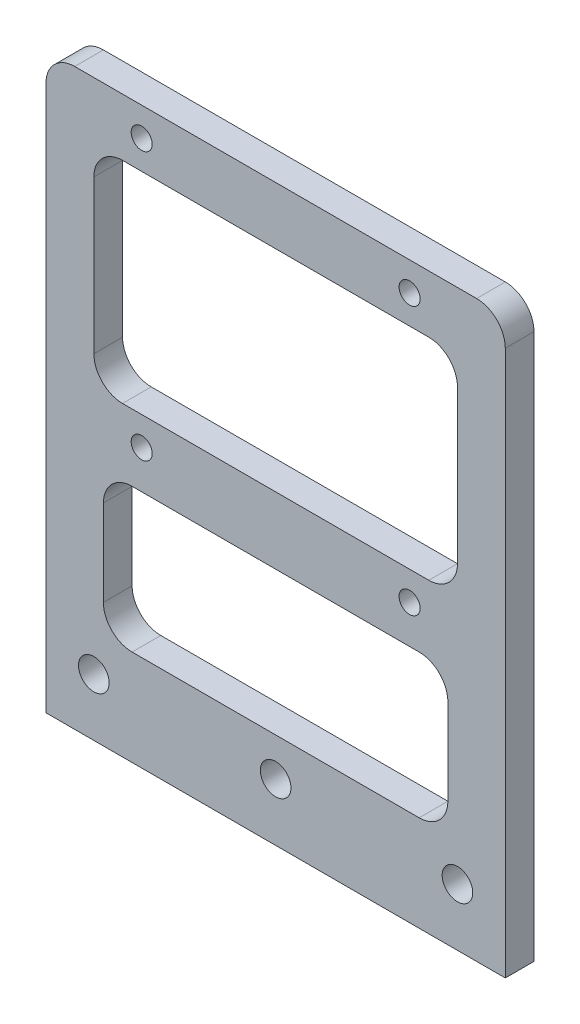
ISO-10303-21;
HEADER;
FILE_DESCRIPTION(('STEP AP214'),'2;1');
FILE_NAME('part.step','',(''),(''),'','','');
FILE_SCHEMA(('AUTOMOTIVE_DESIGN { 1 0 10303 214 1 1 1 1 }'));
ENDSEC;
DATA;
#1=APPLICATION_CONTEXT('core data for automotive mechanical design processes');
#2=APPLICATION_PROTOCOL_DEFINITION('international standard','automotive_design',2000,#1);
#3=PRODUCT_CONTEXT('',#1,'mechanical');
#4=PRODUCT('Part','Part','',(#3));
#5=PRODUCT_RELATED_PRODUCT_CATEGORY('part','',(#4));
#6=PRODUCT_DEFINITION_FORMATION('','',#4);
#7=PRODUCT_DEFINITION_CONTEXT('part definition',#1,'design');
#8=PRODUCT_DEFINITION('design','',#6,#7);
#9=PRODUCT_DEFINITION_SHAPE('','',#8);
#10=(LENGTH_UNIT() NAMED_UNIT(*) SI_UNIT(.MILLI.,.METRE.));
#11=(NAMED_UNIT(*) PLANE_ANGLE_UNIT() SI_UNIT($,.RADIAN.));
#12=(NAMED_UNIT(*) SI_UNIT($,.STERADIAN.) SOLID_ANGLE_UNIT());
#13=UNCERTAINTY_MEASURE_WITH_UNIT(LENGTH_MEASURE(1.E-05),#10,'distance_accuracy_value','');
#14=(GEOMETRIC_REPRESENTATION_CONTEXT(3) GLOBAL_UNCERTAINTY_ASSIGNED_CONTEXT((#13)) GLOBAL_UNIT_ASSIGNED_CONTEXT((#10,
#11,#12)) REPRESENTATION_CONTEXT('',''));
#15=CARTESIAN_POINT('',(0.,0.,0.));
#16=DIRECTION('',(0.,0.,1.));
#17=DIRECTION('',(1.,0.,0.));
#18=AXIS2_PLACEMENT_3D('',#15,#16,#17);
#19=CARTESIAN_POINT('',(0.,0.,3.));
#20=DIRECTION('',(0.,0.,-1.));
#21=DIRECTION('',(-1.,0.,0.));
#22=AXIS2_PLACEMENT_3D('',#19,#20,#21);
#23=PLANE('',#22);
#24=DIRECTION('',(0.,-1.,0.));
#25=VECTOR('',#24,1.);
#26=CARTESIAN_POINT('',(-18.,25.,3.));
#27=LINE('',#26,#25);
#28=CARTESIAN_POINT('',(-18.,22.,3.));
#29=VERTEX_POINT('',#28);
#30=CARTESIAN_POINT('',(-18.,13.,3.));
#31=VERTEX_POINT('',#30);
#32=EDGE_CURVE('E335',#29,#31,#27,.T.);
#33=ORIENTED_EDGE('',*,*,#32,.F.);
#34=CARTESIAN_POINT('',(-15.,22.,3.));
#35=DIRECTION('',(0.,0.,-1.));
#36=DIRECTION('',(-1.,0.,0.));
#37=AXIS2_PLACEMENT_3D('',#34,#35,#36);
#38=CIRCLE('',#37,3.);
#39=CARTESIAN_POINT('',(-15.,25.,3.));
#40=VERTEX_POINT('',#39);
#41=EDGE_CURVE('E11',#29,#40,#38,.T.);
#42=ORIENTED_EDGE('',*,*,#41,.T.);
#43=DIRECTION('',(-1.,0.,0.));
#44=VECTOR('',#43,1.);
#45=CARTESIAN_POINT('',(18.,25.,3.));
#46=LINE('',#45,#44);
#47=CARTESIAN_POINT('',(15.,25.,3.));
#48=VERTEX_POINT('',#47);
#49=EDGE_CURVE('E317',#48,#40,#46,.T.);
#50=ORIENTED_EDGE('',*,*,#49,.F.);
#51=CARTESIAN_POINT('',(15.,22.,3.));
#52=DIRECTION('',(0.,0.,-1.));
#53=DIRECTION('',(-1.,0.,0.));
#54=AXIS2_PLACEMENT_3D('',#51,#52,#53);
#55=CIRCLE('',#54,3.);
#56=CARTESIAN_POINT('',(18.,22.,3.));
#57=VERTEX_POINT('',#56);
#58=EDGE_CURVE('E296',#48,#57,#55,.T.);
#59=ORIENTED_EDGE('',*,*,#58,.T.);
#60=DIRECTION('',(0.,1.,0.));
#61=VECTOR('',#60,1.);
#62=CARTESIAN_POINT('',(18.,10.,3.));
#63=LINE('',#62,#61);
#64=CARTESIAN_POINT('',(18.,13.,3.));
#65=VERTEX_POINT('',#64);
#66=EDGE_CURVE('E320',#65,#57,#63,.T.);
#67=ORIENTED_EDGE('',*,*,#66,.F.);
#68=CARTESIAN_POINT('',(15.,13.,3.));
#69=DIRECTION('',(0.,0.,-1.));
#70=DIRECTION('',(-1.,0.,0.));
#71=AXIS2_PLACEMENT_3D('',#68,#69,#70);
#72=CIRCLE('',#71,3.);
#73=CARTESIAN_POINT('',(15.,10.,3.));
#74=VERTEX_POINT('',#73);
#75=EDGE_CURVE('E288',#65,#74,#72,.T.);
#76=ORIENTED_EDGE('',*,*,#75,.T.);
#77=DIRECTION('',(1.,0.,0.));
#78=VECTOR('',#77,1.);
#79=CARTESIAN_POINT('',(-18.,9.99999999999999,3.));
#80=LINE('',#79,#78);
#81=CARTESIAN_POINT('',(-15.,10.,3.));
#82=VERTEX_POINT('',#81);
#83=EDGE_CURVE('E326',#82,#74,#80,.T.);
#84=ORIENTED_EDGE('',*,*,#83,.F.);
#85=CARTESIAN_POINT('',(-15.,13.,3.));
#86=DIRECTION('',(0.,0.,-1.));
#87=DIRECTION('',(-1.,0.,0.));
#88=AXIS2_PLACEMENT_3D('',#85,#86,#87);
#89=CIRCLE('',#88,3.);
#90=EDGE_CURVE('E292',#82,#31,#89,.T.);
#91=ORIENTED_EDGE('',*,*,#90,.T.);
#92=EDGE_LOOP('',(#33,#42,#50,#59,#67,#76,#84,#91));
#93=FACE_BOUND('',#92,.T.);
#94=DIRECTION('',(-1.,0.,0.));
#95=VECTOR('',#94,1.);
#96=CARTESIAN_POINT('',(-24.,60.,3.));
#97=LINE('',#96,#95);
#98=CARTESIAN_POINT('',(21.,60.,3.));
#99=VERTEX_POINT('',#98);
#100=CARTESIAN_POINT('',(-21.,60.,3.));
#101=VERTEX_POINT('',#100);
#102=EDGE_CURVE('E214',#99,#101,#97,.T.);
#103=ORIENTED_EDGE('',*,*,#102,.T.);
#104=CARTESIAN_POINT('',(-21.,57.,3.));
#105=DIRECTION('',(0.,0.,-1.));
#106=DIRECTION('',(-1.,0.,0.));
#107=AXIS2_PLACEMENT_3D('',#104,#105,#106);
#108=CIRCLE('',#107,3.);
#109=CARTESIAN_POINT('',(-24.,57.,3.));
#110=VERTEX_POINT('',#109);
#111=EDGE_CURVE('E190',#101,#110,#108,.F.);
#112=ORIENTED_EDGE('',*,*,#111,.T.);
#113=DIRECTION('',(0.,-1.,0.));
#114=VECTOR('',#113,1.);
#115=CARTESIAN_POINT('',(-24.,0.,3.));
#116=LINE('',#115,#114);
#117=CARTESIAN_POINT('',(-24.,0.,3.));
#118=VERTEX_POINT('',#117);
#119=EDGE_CURVE('E182',#110,#118,#116,.T.);
#120=ORIENTED_EDGE('',*,*,#119,.T.);
#121=DIRECTION('',(1.,0.,0.));
#122=VECTOR('',#121,1.);
#123=CARTESIAN_POINT('',(-24.,0.,3.));
#124=LINE('',#123,#122);
#125=CARTESIAN_POINT('',(24.,0.,3.));
#126=VERTEX_POINT('',#125);
#127=EDGE_CURVE('E187',#118,#126,#124,.T.);
#128=ORIENTED_EDGE('',*,*,#127,.T.);
#129=DIRECTION('',(0.,1.,0.));
#130=VECTOR('',#129,1.);
#131=CARTESIAN_POINT('',(24.,0.,3.));
#132=LINE('',#131,#130);
#133=CARTESIAN_POINT('',(24.,57.,3.));
#134=VERTEX_POINT('',#133);
#135=EDGE_CURVE('E204',#126,#134,#132,.T.);
#136=ORIENTED_EDGE('',*,*,#135,.T.);
#137=CARTESIAN_POINT('',(21.,57.,3.));
#138=DIRECTION('',(0.,0.,-1.));
#139=DIRECTION('',(-1.,0.,0.));
#140=AXIS2_PLACEMENT_3D('',#137,#138,#139);
#141=CIRCLE('',#140,3.);
#142=EDGE_CURVE('E226',#134,#99,#141,.F.);
#143=ORIENTED_EDGE('',*,*,#142,.T.);
#144=EDGE_LOOP('',(#103,#112,#120,#128,#136,#143));
#145=FACE_BOUND('',#144,.T.);
#146=CARTESIAN_POINT('',(0.,6.,3.));
#147=DIRECTION('',(0.,0.,1.));
#148=DIRECTION('',(1.,0.,0.));
#149=AXIS2_PLACEMENT_3D('',#146,#147,#148);
#150=CIRCLE('',#149,1.6);
#151=CARTESIAN_POINT('',(1.60000000000001,6.,3.));
#152=VERTEX_POINT('',#151);
#153=EDGE_CURVE('E369',#152,#152,#150,.T.);
#154=ORIENTED_EDGE('',*,*,#153,.F.);
#155=EDGE_LOOP('',(#154));
#156=FACE_BOUND('',#155,.T.);
#157=CARTESIAN_POINT('',(-19.,6.,3.));
#158=DIRECTION('',(0.,0.,1.));
#159=DIRECTION('',(1.,0.,0.));
#160=AXIS2_PLACEMENT_3D('',#157,#158,#159);
#161=CIRCLE('',#160,1.6);
#162=CARTESIAN_POINT('',(-17.4,6.,3.));
#163=VERTEX_POINT('',#162);
#164=EDGE_CURVE('E363',#163,#163,#161,.T.);
#165=ORIENTED_EDGE('',*,*,#164,.F.);
#166=EDGE_LOOP('',(#165));
#167=FACE_BOUND('',#166,.T.);
#168=CARTESIAN_POINT('',(19.,6.,3.));
#169=DIRECTION('',(0.,0.,1.));
#170=DIRECTION('',(1.,0.,0.));
#171=AXIS2_PLACEMENT_3D('',#168,#169,#170);
#172=CIRCLE('',#171,1.6);
#173=CARTESIAN_POINT('',(20.6,6.,3.));
#174=VERTEX_POINT('',#173);
#175=EDGE_CURVE('E357',#174,#174,#172,.T.);
#176=ORIENTED_EDGE('',*,*,#175,.F.);
#177=EDGE_LOOP('',(#176));
#178=FACE_BOUND('',#177,.T.);
#179=CARTESIAN_POINT('',(-14.,57.,3.));
#180=DIRECTION('',(0.,0.,1.));
#181=DIRECTION('',(1.,0.,0.));
#182=AXIS2_PLACEMENT_3D('',#179,#180,#181);
#183=CIRCLE('',#182,1.1);
#184=CARTESIAN_POINT('',(-12.9,57.,3.));
#185=VERTEX_POINT('',#184);
#186=EDGE_CURVE('E351',#185,#185,#183,.T.);
#187=ORIENTED_EDGE('',*,*,#186,.F.);
#188=EDGE_LOOP('',(#187));
#189=FACE_BOUND('',#188,.T.);
#190=CARTESIAN_POINT('',(-14.,29.,3.));
#191=DIRECTION('',(0.,0.,1.));
#192=DIRECTION('',(1.,0.,0.));
#193=AXIS2_PLACEMENT_3D('',#190,#191,#192);
#194=CIRCLE('',#193,1.1);
#195=CARTESIAN_POINT('',(-12.9,29.,3.));
#196=VERTEX_POINT('',#195);
#197=EDGE_CURVE('E345',#196,#196,#194,.T.);
#198=ORIENTED_EDGE('',*,*,#197,.F.);
#199=EDGE_LOOP('',(#198));
#200=FACE_BOUND('',#199,.T.);
#201=CARTESIAN_POINT('',(14.,57.,3.));
#202=DIRECTION('',(0.,0.,1.));
#203=DIRECTION('',(1.,0.,0.));
#204=AXIS2_PLACEMENT_3D('',#201,#202,#203);
#205=CIRCLE('',#204,1.1);
#206=CARTESIAN_POINT('',(15.1,57.,3.));
#207=VERTEX_POINT('',#206);
#208=EDGE_CURVE('E339',#207,#207,#205,.T.);
#209=ORIENTED_EDGE('',*,*,#208,.F.);
#210=EDGE_LOOP('',(#209));
#211=FACE_BOUND('',#210,.T.);
#212=CARTESIAN_POINT('',(14.,29.,3.));
#213=DIRECTION('',(0.,0.,1.));
#214=DIRECTION('',(1.,0.,0.));
#215=AXIS2_PLACEMENT_3D('',#212,#213,#214);
#216=CIRCLE('',#215,1.1);
#217=CARTESIAN_POINT('',(15.1,29.,3.));
#218=VERTEX_POINT('',#217);
#219=EDGE_CURVE('E323',#218,#218,#216,.T.);
#220=ORIENTED_EDGE('',*,*,#219,.F.);
#221=EDGE_LOOP('',(#220));
#222=FACE_BOUND('',#221,.T.);
#223=DIRECTION('',(0.,1.,0.));
#224=VECTOR('',#223,1.);
#225=CARTESIAN_POINT('',(19.,54.,3.));
#226=LINE('',#225,#224);
#227=CARTESIAN_POINT('',(19.,35.,3.));
#228=VERTEX_POINT('',#227);
#229=CARTESIAN_POINT('',(19.,51.,3.));
#230=VERTEX_POINT('',#229);
#231=EDGE_CURVE('E708',#228,#230,#226,.T.);
#232=ORIENTED_EDGE('',*,*,#231,.F.);
#233=CARTESIAN_POINT('',(16.,35.,3.));
#234=DIRECTION('',(0.,0.,-1.));
#235=DIRECTION('',(-1.,0.,0.));
#236=AXIS2_PLACEMENT_3D('',#233,#234,#235);
#237=CIRCLE('',#236,3.);
#238=CARTESIAN_POINT('',(16.,32.,3.));
#239=VERTEX_POINT('',#238);
#240=EDGE_CURVE('E253',#228,#239,#237,.T.);
#241=ORIENTED_EDGE('',*,*,#240,.T.);
#242=DIRECTION('',(1.,0.,0.));
#243=VECTOR('',#242,1.);
#244=CARTESIAN_POINT('',(-19.,32.,3.));
#245=LINE('',#244,#243);
#246=CARTESIAN_POINT('',(-16.,32.,3.));
#247=VERTEX_POINT('',#246);
#248=EDGE_CURVE('E314',#247,#239,#245,.T.);
#249=ORIENTED_EDGE('',*,*,#248,.F.);
#250=CARTESIAN_POINT('',(-16.,35.,3.));
#251=DIRECTION('',(0.,0.,-1.));
#252=DIRECTION('',(-1.,0.,0.));
#253=AXIS2_PLACEMENT_3D('',#250,#251,#252);
#254=CIRCLE('',#253,3.);
#255=CARTESIAN_POINT('',(-19.,35.,3.));
#256=VERTEX_POINT('',#255);
#257=EDGE_CURVE('E265',#247,#256,#254,.T.);
#258=ORIENTED_EDGE('',*,*,#257,.T.);
#259=DIRECTION('',(0.,-1.,0.));
#260=VECTOR('',#259,1.);
#261=CARTESIAN_POINT('',(-19.,54.,3.));
#262=LINE('',#261,#260);
#263=CARTESIAN_POINT('',(-19.,51.,3.));
#264=VERTEX_POINT('',#263);
#265=EDGE_CURVE('E720',#264,#256,#262,.T.);
#266=ORIENTED_EDGE('',*,*,#265,.F.);
#267=CARTESIAN_POINT('',(-16.,51.,3.));
#268=DIRECTION('',(0.,0.,-1.));
#269=DIRECTION('',(-1.,0.,0.));
#270=AXIS2_PLACEMENT_3D('',#267,#268,#269);
#271=CIRCLE('',#270,3.);
#272=CARTESIAN_POINT('',(-16.,54.,3.));
#273=VERTEX_POINT('',#272);
#274=EDGE_CURVE('E261',#264,#273,#271,.T.);
#275=ORIENTED_EDGE('',*,*,#274,.T.);
#276=DIRECTION('',(-1.,0.,0.));
#277=VECTOR('',#276,1.);
#278=CARTESIAN_POINT('',(-19.,54.,3.));
#279=LINE('',#278,#277);
#280=CARTESIAN_POINT('',(16.,54.,3.));
#281=VERTEX_POINT('',#280);
#282=EDGE_CURVE('E723',#281,#273,#279,.T.);
#283=ORIENTED_EDGE('',*,*,#282,.F.);
#284=CARTESIAN_POINT('',(16.,51.,3.));
#285=DIRECTION('',(0.,0.,-1.));
#286=DIRECTION('',(-1.,0.,0.));
#287=AXIS2_PLACEMENT_3D('',#284,#285,#286);
#288=CIRCLE('',#287,3.);
#289=EDGE_CURVE('E257',#281,#230,#288,.T.);
#290=ORIENTED_EDGE('',*,*,#289,.T.);
#291=EDGE_LOOP('',(#232,#241,#249,#258,#266,#275,#283,#290));
#292=FACE_BOUND('',#291,.T.);
#293=ADVANCED_FACE('F34',(#93,#145,#156,#167,#178,#189,#200,#211,#222,#292),#23,.F.);
#294=CARTESIAN_POINT('',(0.,0.,0.));
#295=DIRECTION('',(0.,0.,-1.));
#296=DIRECTION('',(-1.,0.,0.));
#297=AXIS2_PLACEMENT_3D('',#294,#295,#296);
#298=PLANE('',#297);
#299=CARTESIAN_POINT('',(14.,57.,0.));
#300=DIRECTION('',(0.,0.,1.));
#301=DIRECTION('',(1.,0.,0.));
#302=AXIS2_PLACEMENT_3D('',#299,#300,#301);
#303=CIRCLE('',#302,1.1);
#304=CARTESIAN_POINT('',(15.1,57.,0.));
#305=VERTEX_POINT('',#304);
#306=EDGE_CURVE('E337',#305,#305,#303,.T.);
#307=ORIENTED_EDGE('',*,*,#306,.T.);
#308=EDGE_LOOP('',(#307));
#309=FACE_BOUND('',#308,.T.);
#310=CARTESIAN_POINT('',(-14.,57.,0.));
#311=DIRECTION('',(0.,0.,1.));
#312=DIRECTION('',(1.,0.,0.));
#313=AXIS2_PLACEMENT_3D('',#310,#311,#312);
#314=CIRCLE('',#313,1.1);
#315=CARTESIAN_POINT('',(-12.9,57.,0.));
#316=VERTEX_POINT('',#315);
#317=EDGE_CURVE('E348',#316,#316,#314,.T.);
#318=ORIENTED_EDGE('',*,*,#317,.T.);
#319=EDGE_LOOP('',(#318));
#320=FACE_BOUND('',#319,.T.);
#321=CARTESIAN_POINT('',(-19.,6.,0.));
#322=DIRECTION('',(0.,0.,1.));
#323=DIRECTION('',(1.,0.,0.));
#324=AXIS2_PLACEMENT_3D('',#321,#322,#323);
#325=CIRCLE('',#324,1.6);
#326=CARTESIAN_POINT('',(-17.4,6.,0.));
#327=VERTEX_POINT('',#326);
#328=EDGE_CURVE('E360',#327,#327,#325,.T.);
#329=ORIENTED_EDGE('',*,*,#328,.T.);
#330=EDGE_LOOP('',(#329));
#331=FACE_BOUND('',#330,.T.);
#332=DIRECTION('',(0.,-1.,0.));
#333=VECTOR('',#332,1.);
#334=CARTESIAN_POINT('',(-24.,0.,0.));
#335=LINE('',#334,#333);
#336=CARTESIAN_POINT('',(-24.,57.,0.));
#337=VERTEX_POINT('',#336);
#338=CARTESIAN_POINT('',(-24.,0.,0.));
#339=VERTEX_POINT('',#338);
#340=EDGE_CURVE('E208',#337,#339,#335,.T.);
#341=ORIENTED_EDGE('',*,*,#340,.F.);
#342=CARTESIAN_POINT('',(-21.,57.,0.));
#343=DIRECTION('',(0.,0.,-1.));
#344=DIRECTION('',(-1.,0.,0.));
#345=AXIS2_PLACEMENT_3D('',#342,#343,#344);
#346=CIRCLE('',#345,3.);
#347=CARTESIAN_POINT('',(-21.,60.,0.));
#348=VERTEX_POINT('',#347);
#349=EDGE_CURVE('E219',#337,#348,#346,.T.);
#350=ORIENTED_EDGE('',*,*,#349,.T.);
#351=DIRECTION('',(-1.,0.,0.));
#352=VECTOR('',#351,1.);
#353=CARTESIAN_POINT('',(-24.,60.,0.));
#354=LINE('',#353,#352);
#355=CARTESIAN_POINT('',(21.,60.,0.));
#356=VERTEX_POINT('',#355);
#357=EDGE_CURVE('E195',#356,#348,#354,.T.);
#358=ORIENTED_EDGE('',*,*,#357,.F.);
#359=CARTESIAN_POINT('',(21.,57.,0.));
#360=DIRECTION('',(0.,0.,-1.));
#361=DIRECTION('',(-1.,0.,0.));
#362=AXIS2_PLACEMENT_3D('',#359,#360,#361);
#363=CIRCLE('',#362,3.);
#364=CARTESIAN_POINT('',(24.,57.,0.));
#365=VERTEX_POINT('',#364);
#366=EDGE_CURVE('E212',#356,#365,#363,.T.);
#367=ORIENTED_EDGE('',*,*,#366,.T.);
#368=DIRECTION('',(0.,1.,0.));
#369=VECTOR('',#368,1.);
#370=CARTESIAN_POINT('',(24.,0.,0.));
#371=LINE('',#370,#369);
#372=CARTESIAN_POINT('',(24.,0.,0.));
#373=VERTEX_POINT('',#372);
#374=EDGE_CURVE('E379',#373,#365,#371,.T.);
#375=ORIENTED_EDGE('',*,*,#374,.F.);
#376=DIRECTION('',(1.,0.,0.));
#377=VECTOR('',#376,1.);
#378=CARTESIAN_POINT('',(-24.,0.,0.));
#379=LINE('',#378,#377);
#380=EDGE_CURVE('E377',#339,#373,#379,.T.);
#381=ORIENTED_EDGE('',*,*,#380,.F.);
#382=EDGE_LOOP('',(#341,#350,#358,#367,#375,#381));
#383=FACE_BOUND('',#382,.T.);
#384=CARTESIAN_POINT('',(0.,6.,0.));
#385=DIRECTION('',(0.,0.,1.));
#386=DIRECTION('',(1.,0.,0.));
#387=AXIS2_PLACEMENT_3D('',#384,#385,#386);
#388=CIRCLE('',#387,1.6);
#389=CARTESIAN_POINT('',(1.60000000000001,6.,0.));
#390=VERTEX_POINT('',#389);
#391=EDGE_CURVE('E366',#390,#390,#388,.T.);
#392=ORIENTED_EDGE('',*,*,#391,.T.);
#393=EDGE_LOOP('',(#392));
#394=FACE_BOUND('',#393,.T.);
#395=CARTESIAN_POINT('',(19.,6.,0.));
#396=DIRECTION('',(0.,0.,1.));
#397=DIRECTION('',(1.,0.,0.));
#398=AXIS2_PLACEMENT_3D('',#395,#396,#397);
#399=CIRCLE('',#398,1.6);
#400=CARTESIAN_POINT('',(20.6,6.,0.));
#401=VERTEX_POINT('',#400);
#402=EDGE_CURVE('E354',#401,#401,#399,.T.);
#403=ORIENTED_EDGE('',*,*,#402,.T.);
#404=EDGE_LOOP('',(#403));
#405=FACE_BOUND('',#404,.T.);
#406=CARTESIAN_POINT('',(-14.,29.,0.));
#407=DIRECTION('',(0.,0.,1.));
#408=DIRECTION('',(1.,0.,0.));
#409=AXIS2_PLACEMENT_3D('',#406,#407,#408);
#410=CIRCLE('',#409,1.1);
#411=CARTESIAN_POINT('',(-12.9,29.,0.));
#412=VERTEX_POINT('',#411);
#413=EDGE_CURVE('E342',#412,#412,#410,.T.);
#414=ORIENTED_EDGE('',*,*,#413,.T.);
#415=EDGE_LOOP('',(#414));
#416=FACE_BOUND('',#415,.T.);
#417=CARTESIAN_POINT('',(14.,29.,0.));
#418=DIRECTION('',(0.,0.,1.));
#419=DIRECTION('',(1.,0.,0.));
#420=AXIS2_PLACEMENT_3D('',#417,#418,#419);
#421=CIRCLE('',#420,1.1);
#422=CARTESIAN_POINT('',(15.1,29.,0.));
#423=VERTEX_POINT('',#422);
#424=EDGE_CURVE('E319',#423,#423,#421,.T.);
#425=ORIENTED_EDGE('',*,*,#424,.T.);
#426=EDGE_LOOP('',(#425));
#427=FACE_BOUND('',#426,.T.);
#428=DIRECTION('',(0.,1.,0.));
#429=VECTOR('',#428,1.);
#430=CARTESIAN_POINT('',(18.,10.,0.));
#431=LINE('',#430,#429);
#432=CARTESIAN_POINT('',(18.,13.,0.));
#433=VERTEX_POINT('',#432);
#434=CARTESIAN_POINT('',(18.,22.,0.));
#435=VERTEX_POINT('',#434);
#436=EDGE_CURVE('E332',#433,#435,#431,.T.);
#437=ORIENTED_EDGE('',*,*,#436,.T.);
#438=CARTESIAN_POINT('',(15.,22.,0.));
#439=DIRECTION('',(0.,0.,-1.));
#440=DIRECTION('',(-1.,0.,0.));
#441=AXIS2_PLACEMENT_3D('',#438,#439,#440);
#442=CIRCLE('',#441,3.);
#443=CARTESIAN_POINT('',(15.,25.,0.));
#444=VERTEX_POINT('',#443);
#445=EDGE_CURVE('E294',#435,#444,#442,.F.);
#446=ORIENTED_EDGE('',*,*,#445,.T.);
#447=DIRECTION('',(-1.,0.,0.));
#448=VECTOR('',#447,1.);
#449=CARTESIAN_POINT('',(18.,25.,0.));
#450=LINE('',#449,#448);
#451=CARTESIAN_POINT('',(-15.,25.,0.));
#452=VERTEX_POINT('',#451);
#453=EDGE_CURVE('E305',#444,#452,#450,.T.);
#454=ORIENTED_EDGE('',*,*,#453,.T.);
#455=CARTESIAN_POINT('',(-15.,22.,0.));
#456=DIRECTION('',(0.,0.,-1.));
#457=DIRECTION('',(-1.,0.,0.));
#458=AXIS2_PLACEMENT_3D('',#455,#456,#457);
#459=CIRCLE('',#458,3.);
#460=CARTESIAN_POINT('',(-18.,22.,0.));
#461=VERTEX_POINT('',#460);
#462=EDGE_CURVE('E42',#452,#461,#459,.F.);
#463=ORIENTED_EDGE('',*,*,#462,.T.);
#464=DIRECTION('',(0.,-1.,0.));
#465=VECTOR('',#464,1.);
#466=CARTESIAN_POINT('',(-18.,25.,0.));
#467=LINE('',#466,#465);
#468=CARTESIAN_POINT('',(-18.,13.,0.));
#469=VERTEX_POINT('',#468);
#470=EDGE_CURVE('E304',#461,#469,#467,.T.);
#471=ORIENTED_EDGE('',*,*,#470,.T.);
#472=CARTESIAN_POINT('',(-15.,13.,0.));
#473=DIRECTION('',(0.,0.,-1.));
#474=DIRECTION('',(-1.,0.,0.));
#475=AXIS2_PLACEMENT_3D('',#472,#473,#474);
#476=CIRCLE('',#475,3.);
#477=CARTESIAN_POINT('',(-15.,10.,0.));
#478=VERTEX_POINT('',#477);
#479=EDGE_CURVE('E290',#469,#478,#476,.F.);
#480=ORIENTED_EDGE('',*,*,#479,.T.);
#481=DIRECTION('',(1.,0.,0.));
#482=VECTOR('',#481,1.);
#483=CARTESIAN_POINT('',(3.7913784902066,10.,0.));
#484=LINE('',#483,#482);
#485=CARTESIAN_POINT('',(15.,10.,0.));
#486=VERTEX_POINT('',#485);
#487=EDGE_CURVE('E313',#478,#486,#484,.T.);
#488=ORIENTED_EDGE('',*,*,#487,.T.);
#489=CARTESIAN_POINT('',(15.,13.,0.));
#490=DIRECTION('',(0.,0.,-1.));
#491=DIRECTION('',(-1.,0.,0.));
#492=AXIS2_PLACEMENT_3D('',#489,#490,#491);
#493=CIRCLE('',#492,3.);
#494=EDGE_CURVE('E286',#486,#433,#493,.F.);
#495=ORIENTED_EDGE('',*,*,#494,.T.);
#496=EDGE_LOOP('',(#437,#446,#454,#463,#471,#480,#488,#495));
#497=FACE_BOUND('',#496,.T.);
#498=DIRECTION('',(0.,-1.,0.));
#499=VECTOR('',#498,1.);
#500=CARTESIAN_POINT('',(-19.,54.,0.));
#501=LINE('',#500,#499);
#502=CARTESIAN_POINT('',(-19.,51.,0.));
#503=VERTEX_POINT('',#502);
#504=CARTESIAN_POINT('',(-19.,35.,0.));
#505=VERTEX_POINT('',#504);
#506=EDGE_CURVE('E709',#503,#505,#501,.T.);
#507=ORIENTED_EDGE('',*,*,#506,.T.);
#508=CARTESIAN_POINT('',(-16.,35.,0.));
#509=DIRECTION('',(0.,0.,-1.));
#510=DIRECTION('',(-1.,0.,0.));
#511=AXIS2_PLACEMENT_3D('',#508,#509,#510);
#512=CIRCLE('',#511,3.);
#513=CARTESIAN_POINT('',(-16.,32.,0.));
#514=VERTEX_POINT('',#513);
#515=EDGE_CURVE('E263',#505,#514,#512,.F.);
#516=ORIENTED_EDGE('',*,*,#515,.T.);
#517=DIRECTION('',(1.,0.,0.));
#518=VECTOR('',#517,1.);
#519=CARTESIAN_POINT('',(-19.,32.,0.));
#520=LINE('',#519,#518);
#521=CARTESIAN_POINT('',(16.,32.,0.));
#522=VERTEX_POINT('',#521);
#523=EDGE_CURVE('E705',#514,#522,#520,.T.);
#524=ORIENTED_EDGE('',*,*,#523,.T.);
#525=CARTESIAN_POINT('',(16.,35.,0.));
#526=DIRECTION('',(0.,0.,-1.));
#527=DIRECTION('',(-1.,0.,0.));
#528=AXIS2_PLACEMENT_3D('',#525,#526,#527);
#529=CIRCLE('',#528,3.);
#530=CARTESIAN_POINT('',(19.,35.,0.));
#531=VERTEX_POINT('',#530);
#532=EDGE_CURVE('E251',#522,#531,#529,.F.);
#533=ORIENTED_EDGE('',*,*,#532,.T.);
#534=DIRECTION('',(0.,1.,0.));
#535=VECTOR('',#534,1.);
#536=CARTESIAN_POINT('',(19.,54.,0.));
#537=LINE('',#536,#535);
#538=CARTESIAN_POINT('',(19.,51.,0.));
#539=VERTEX_POINT('',#538);
#540=EDGE_CURVE('E715',#531,#539,#537,.T.);
#541=ORIENTED_EDGE('',*,*,#540,.T.);
#542=CARTESIAN_POINT('',(16.,51.,0.));
#543=DIRECTION('',(0.,0.,-1.));
#544=DIRECTION('',(-1.,0.,0.));
#545=AXIS2_PLACEMENT_3D('',#542,#543,#544);
#546=CIRCLE('',#545,3.);
#547=CARTESIAN_POINT('',(16.,54.,0.));
#548=VERTEX_POINT('',#547);
#549=EDGE_CURVE('E255',#539,#548,#546,.F.);
#550=ORIENTED_EDGE('',*,*,#549,.T.);
#551=DIRECTION('',(-1.,0.,0.));
#552=VECTOR('',#551,1.);
#553=CARTESIAN_POINT('',(-19.,54.,0.));
#554=LINE('',#553,#552);
#555=CARTESIAN_POINT('',(-16.,54.,0.));
#556=VERTEX_POINT('',#555);
#557=EDGE_CURVE('E712',#548,#556,#554,.T.);
#558=ORIENTED_EDGE('',*,*,#557,.T.);
#559=CARTESIAN_POINT('',(-16.,51.,0.));
#560=DIRECTION('',(0.,0.,-1.));
#561=DIRECTION('',(-1.,0.,0.));
#562=AXIS2_PLACEMENT_3D('',#559,#560,#561);
#563=CIRCLE('',#562,3.);
#564=EDGE_CURVE('E259',#556,#503,#563,.F.);
#565=ORIENTED_EDGE('',*,*,#564,.T.);
#566=EDGE_LOOP('',(#507,#516,#524,#533,#541,#550,#558,#565));
#567=FACE_BOUND('',#566,.T.);
#568=ADVANCED_FACE('F302',(#309,#320,#331,#383,#394,#405,#416,#427,#497,#567),#298,.T.);
#569=CARTESIAN_POINT('',(-24.,0.,3.));
#570=DIRECTION('',(1.,0.,0.));
#571=DIRECTION('',(0.,0.,-1.));
#572=AXIS2_PLACEMENT_3D('',#569,#570,#571);
#573=PLANE('',#572);
#574=ORIENTED_EDGE('',*,*,#119,.F.);
#575=DIRECTION('',(0.,0.,-1.));
#576=VECTOR('',#575,1.);
#577=CARTESIAN_POINT('',(-24.,57.,3.));
#578=LINE('',#577,#576);
#579=EDGE_CURVE('E210',#110,#337,#578,.T.);
#580=ORIENTED_EDGE('',*,*,#579,.T.);
#581=ORIENTED_EDGE('',*,*,#340,.T.);
#582=DIRECTION('',(0.,0.,-1.));
#583=VECTOR('',#582,1.);
#584=CARTESIAN_POINT('',(-24.,0.,3.));
#585=LINE('',#584,#583);
#586=EDGE_CURVE('E200',#118,#339,#585,.T.);
#587=ORIENTED_EDGE('',*,*,#586,.F.);
#588=EDGE_LOOP('',(#574,#580,#581,#587));
#589=FACE_BOUND('',#588,.T.);
#590=ADVANCED_FACE('F206',(#589),#573,.F.);
#591=CARTESIAN_POINT('',(-24.,0.,3.));
#592=DIRECTION('',(0.,1.,0.));
#593=DIRECTION('',(0.,0.,1.));
#594=AXIS2_PLACEMENT_3D('',#591,#592,#593);
#595=PLANE('',#594);
#596=ORIENTED_EDGE('',*,*,#380,.T.);
#597=DIRECTION('',(0.,0.,-1.));
#598=VECTOR('',#597,1.);
#599=CARTESIAN_POINT('',(24.,0.,3.));
#600=LINE('',#599,#598);
#601=EDGE_CURVE('E202',#126,#373,#600,.T.);
#602=ORIENTED_EDGE('',*,*,#601,.F.);
#603=ORIENTED_EDGE('',*,*,#127,.F.);
#604=ORIENTED_EDGE('',*,*,#586,.T.);
#605=EDGE_LOOP('',(#596,#602,#603,#604));
#606=FACE_BOUND('',#605,.T.);
#607=ADVANCED_FACE('F199',(#606),#595,.F.);
#608=CARTESIAN_POINT('',(24.,0.,3.));
#609=DIRECTION('',(-1.,0.,0.));
#610=DIRECTION('',(0.,0.,1.));
#611=AXIS2_PLACEMENT_3D('',#608,#609,#610);
#612=PLANE('',#611);
#613=ORIENTED_EDGE('',*,*,#374,.T.);
#614=DIRECTION('',(0.,0.,-1.));
#615=VECTOR('',#614,1.);
#616=CARTESIAN_POINT('',(24.,57.,3.));
#617=LINE('',#616,#615);
#618=EDGE_CURVE('E229',#365,#134,#617,.F.);
#619=ORIENTED_EDGE('',*,*,#618,.T.);
#620=ORIENTED_EDGE('',*,*,#135,.F.);
#621=ORIENTED_EDGE('',*,*,#601,.T.);
#622=EDGE_LOOP('',(#613,#619,#620,#621));
#623=FACE_BOUND('',#622,.T.);
#624=ADVANCED_FACE('F394',(#623),#612,.F.);
#625=CARTESIAN_POINT('',(-24.,60.,3.));
#626=DIRECTION('',(0.,-1.,0.));
#627=DIRECTION('',(0.,0.,-1.));
#628=AXIS2_PLACEMENT_3D('',#625,#626,#627);
#629=PLANE('',#628);
#630=ORIENTED_EDGE('',*,*,#357,.T.);
#631=DIRECTION('',(0.,0.,-1.));
#632=VECTOR('',#631,1.);
#633=CARTESIAN_POINT('',(-21.,60.,3.));
#634=LINE('',#633,#632);
#635=EDGE_CURVE('E224',#348,#101,#634,.F.);
#636=ORIENTED_EDGE('',*,*,#635,.T.);
#637=ORIENTED_EDGE('',*,*,#102,.F.);
#638=DIRECTION('',(0.,0.,-1.));
#639=VECTOR('',#638,1.);
#640=CARTESIAN_POINT('',(21.,60.,3.));
#641=LINE('',#640,#639);
#642=EDGE_CURVE('E221',#99,#356,#641,.T.);
#643=ORIENTED_EDGE('',*,*,#642,.T.);
#644=EDGE_LOOP('',(#630,#636,#637,#643));
#645=FACE_BOUND('',#644,.T.);
#646=ADVANCED_FACE('F385',(#645),#629,.F.);
#647=CARTESIAN_POINT('',(0.,6.,3.));
#648=DIRECTION('',(0.,0.,-1.));
#649=DIRECTION('',(-1.,0.,0.));
#650=AXIS2_PLACEMENT_3D('',#647,#648,#649);
#651=CYLINDRICAL_SURFACE('',#650,1.6);
#652=ORIENTED_EDGE('',*,*,#153,.T.);
#653=EDGE_LOOP('',(#652));
#654=FACE_BOUND('',#653,.T.);
#655=ORIENTED_EDGE('',*,*,#391,.F.);
#656=EDGE_LOOP('',(#655));
#657=FACE_BOUND('',#656,.T.);
#658=ADVANCED_FACE('F419',(#654,#657),#651,.F.);
#659=CARTESIAN_POINT('',(-19.,6.,3.));
#660=DIRECTION('',(0.,0.,-1.));
#661=DIRECTION('',(-1.,0.,0.));
#662=AXIS2_PLACEMENT_3D('',#659,#660,#661);
#663=CYLINDRICAL_SURFACE('',#662,1.6);
#664=ORIENTED_EDGE('',*,*,#164,.T.);
#665=EDGE_LOOP('',(#664));
#666=FACE_BOUND('',#665,.T.);
#667=ORIENTED_EDGE('',*,*,#328,.F.);
#668=EDGE_LOOP('',(#667));
#669=FACE_BOUND('',#668,.T.);
#670=ADVANCED_FACE('F453',(#666,#669),#663,.F.);
#671=CARTESIAN_POINT('',(19.,6.,3.));
#672=DIRECTION('',(0.,0.,-1.));
#673=DIRECTION('',(-1.,0.,0.));
#674=AXIS2_PLACEMENT_3D('',#671,#672,#673);
#675=CYLINDRICAL_SURFACE('',#674,1.6);
#676=ORIENTED_EDGE('',*,*,#175,.T.);
#677=EDGE_LOOP('',(#676));
#678=FACE_BOUND('',#677,.T.);
#679=ORIENTED_EDGE('',*,*,#402,.F.);
#680=EDGE_LOOP('',(#679));
#681=FACE_BOUND('',#680,.T.);
#682=ADVANCED_FACE('F460',(#678,#681),#675,.F.);
#683=CARTESIAN_POINT('',(-14.,57.,3.));
#684=DIRECTION('',(0.,0.,-1.));
#685=DIRECTION('',(-1.,0.,0.));
#686=AXIS2_PLACEMENT_3D('',#683,#684,#685);
#687=CYLINDRICAL_SURFACE('',#686,1.1);
#688=ORIENTED_EDGE('',*,*,#186,.T.);
#689=EDGE_LOOP('',(#688));
#690=FACE_BOUND('',#689,.T.);
#691=ORIENTED_EDGE('',*,*,#317,.F.);
#692=EDGE_LOOP('',(#691));
#693=FACE_BOUND('',#692,.T.);
#694=ADVANCED_FACE('F467',(#690,#693),#687,.F.);
#695=CARTESIAN_POINT('',(-14.,29.,3.));
#696=DIRECTION('',(0.,0.,-1.));
#697=DIRECTION('',(-1.,0.,0.));
#698=AXIS2_PLACEMENT_3D('',#695,#696,#697);
#699=CYLINDRICAL_SURFACE('',#698,1.1);
#700=ORIENTED_EDGE('',*,*,#197,.T.);
#701=EDGE_LOOP('',(#700));
#702=FACE_BOUND('',#701,.T.);
#703=ORIENTED_EDGE('',*,*,#413,.F.);
#704=EDGE_LOOP('',(#703));
#705=FACE_BOUND('',#704,.T.);
#706=ADVANCED_FACE('F475',(#702,#705),#699,.F.);
#707=CARTESIAN_POINT('',(14.,57.,3.));
#708=DIRECTION('',(0.,0.,-1.));
#709=DIRECTION('',(-1.,0.,0.));
#710=AXIS2_PLACEMENT_3D('',#707,#708,#709);
#711=CYLINDRICAL_SURFACE('',#710,1.1);
#712=ORIENTED_EDGE('',*,*,#208,.T.);
#713=EDGE_LOOP('',(#712));
#714=FACE_BOUND('',#713,.T.);
#715=ORIENTED_EDGE('',*,*,#306,.F.);
#716=EDGE_LOOP('',(#715));
#717=FACE_BOUND('',#716,.T.);
#718=ADVANCED_FACE('F483',(#714,#717),#711,.F.);
#719=CARTESIAN_POINT('',(14.,29.,3.));
#720=DIRECTION('',(0.,0.,-1.));
#721=DIRECTION('',(-1.,0.,0.));
#722=AXIS2_PLACEMENT_3D('',#719,#720,#721);
#723=CYLINDRICAL_SURFACE('',#722,1.1);
#724=ORIENTED_EDGE('',*,*,#219,.T.);
#725=EDGE_LOOP('',(#724));
#726=FACE_BOUND('',#725,.T.);
#727=ORIENTED_EDGE('',*,*,#424,.F.);
#728=EDGE_LOOP('',(#727));
#729=FACE_BOUND('',#728,.T.);
#730=ADVANCED_FACE('F491',(#726,#729),#723,.F.);
#731=CARTESIAN_POINT('',(-18.,25.,3.));
#732=DIRECTION('',(1.,0.,0.));
#733=DIRECTION('',(0.,1.,0.));
#734=AXIS2_PLACEMENT_3D('',#731,#732,#733);
#735=PLANE('',#734);
#736=ORIENTED_EDGE('',*,*,#32,.T.);
#737=DIRECTION('',(0.,0.,-1.));
#738=VECTOR('',#737,1.);
#739=CARTESIAN_POINT('',(-18.,13.,0.));
#740=LINE('',#739,#738);
#741=EDGE_CURVE('E279',#31,#469,#740,.T.);
#742=ORIENTED_EDGE('',*,*,#741,.T.);
#743=ORIENTED_EDGE('',*,*,#470,.F.);
#744=DIRECTION('',(0.,0.,-1.));
#745=VECTOR('',#744,1.);
#746=CARTESIAN_POINT('',(-18.,22.,3.));
#747=LINE('',#746,#745);
#748=EDGE_CURVE('E277',#461,#29,#747,.F.);
#749=ORIENTED_EDGE('',*,*,#748,.T.);
#750=EDGE_LOOP('',(#736,#742,#743,#749));
#751=FACE_BOUND('',#750,.T.);
#752=ADVANCED_FACE('F311',(#751),#735,.T.);
#753=CARTESIAN_POINT('',(3.7913784902066,10.,3.));
#754=DIRECTION('',(0.,1.,0.));
#755=DIRECTION('',(-1.,0.,0.));
#756=AXIS2_PLACEMENT_3D('',#753,#754,#755);
#757=PLANE('',#756);
#758=ORIENTED_EDGE('',*,*,#83,.T.);
#759=DIRECTION('',(0.,0.,-1.));
#760=VECTOR('',#759,1.);
#761=CARTESIAN_POINT('',(15.,10.,0.));
#762=LINE('',#761,#760);
#763=EDGE_CURVE('E269',#74,#486,#762,.T.);
#764=ORIENTED_EDGE('',*,*,#763,.T.);
#765=ORIENTED_EDGE('',*,*,#487,.F.);
#766=DIRECTION('',(0.,0.,-1.));
#767=VECTOR('',#766,1.);
#768=CARTESIAN_POINT('',(-15.,10.,3.));
#769=LINE('',#768,#767);
#770=EDGE_CURVE('E267',#478,#82,#769,.F.);
#771=ORIENTED_EDGE('',*,*,#770,.T.);
#772=EDGE_LOOP('',(#758,#764,#765,#771));
#773=FACE_BOUND('',#772,.T.);
#774=ADVANCED_FACE('F505',(#773),#757,.T.);
#775=CARTESIAN_POINT('',(18.,10.,3.));
#776=DIRECTION('',(-1.,0.,0.));
#777=DIRECTION('',(0.,0.,1.));
#778=AXIS2_PLACEMENT_3D('',#775,#776,#777);
#779=PLANE('',#778);
#780=ORIENTED_EDGE('',*,*,#436,.F.);
#781=DIRECTION('',(0.,0.,-1.));
#782=VECTOR('',#781,1.);
#783=CARTESIAN_POINT('',(18.,13.,3.));
#784=LINE('',#783,#782);
#785=EDGE_CURVE('E275',#433,#65,#784,.F.);
#786=ORIENTED_EDGE('',*,*,#785,.T.);
#787=ORIENTED_EDGE('',*,*,#66,.T.);
#788=DIRECTION('',(0.,0.,-1.));
#789=VECTOR('',#788,1.);
#790=CARTESIAN_POINT('',(18.,22.,0.));
#791=LINE('',#790,#789);
#792=EDGE_CURVE('E272',#57,#435,#791,.T.);
#793=ORIENTED_EDGE('',*,*,#792,.T.);
#794=EDGE_LOOP('',(#780,#786,#787,#793));
#795=FACE_BOUND('',#794,.T.);
#796=ADVANCED_FACE('F512',(#795),#779,.T.);
#797=CARTESIAN_POINT('',(18.,25.,3.));
#798=DIRECTION('',(0.,-1.,0.));
#799=DIRECTION('',(1.,0.,0.));
#800=AXIS2_PLACEMENT_3D('',#797,#798,#799);
#801=PLANE('',#800);
#802=ORIENTED_EDGE('',*,*,#453,.F.);
#803=DIRECTION('',(0.,0.,-1.));
#804=VECTOR('',#803,1.);
#805=CARTESIAN_POINT('',(15.,25.,3.));
#806=LINE('',#805,#804);
#807=EDGE_CURVE('E54',#444,#48,#806,.F.);
#808=ORIENTED_EDGE('',*,*,#807,.T.);
#809=ORIENTED_EDGE('',*,*,#49,.T.);
#810=DIRECTION('',(0.,0.,-1.));
#811=VECTOR('',#810,1.);
#812=CARTESIAN_POINT('',(-15.,25.,0.));
#813=LINE('',#812,#811);
#814=EDGE_CURVE('E282',#40,#452,#813,.T.);
#815=ORIENTED_EDGE('',*,*,#814,.T.);
#816=EDGE_LOOP('',(#802,#808,#809,#815));
#817=FACE_BOUND('',#816,.T.);
#818=ADVANCED_FACE('F316',(#817),#801,.T.);
#819=CARTESIAN_POINT('',(19.,54.,3.));
#820=DIRECTION('',(-1.,0.,0.));
#821=DIRECTION('',(0.,0.,1.));
#822=AXIS2_PLACEMENT_3D('',#819,#820,#821);
#823=PLANE('',#822);
#824=ORIENTED_EDGE('',*,*,#540,.F.);
#825=DIRECTION('',(0.,0.,-1.));
#826=VECTOR('',#825,1.);
#827=CARTESIAN_POINT('',(19.,35.,3.));
#828=LINE('',#827,#826);
#829=EDGE_CURVE('E239',#531,#228,#828,.F.);
#830=ORIENTED_EDGE('',*,*,#829,.T.);
#831=ORIENTED_EDGE('',*,*,#231,.T.);
#832=DIRECTION('',(0.,0.,-1.));
#833=VECTOR('',#832,1.);
#834=CARTESIAN_POINT('',(19.,51.,0.));
#835=LINE('',#834,#833);
#836=EDGE_CURVE('E236',#230,#539,#835,.T.);
#837=ORIENTED_EDGE('',*,*,#836,.T.);
#838=EDGE_LOOP('',(#824,#830,#831,#837));
#839=FACE_BOUND('',#838,.T.);
#840=ADVANCED_FACE('F527',(#839),#823,.T.);
#841=CARTESIAN_POINT('',(-19.,54.,3.));
#842=DIRECTION('',(0.,-1.,0.));
#843=DIRECTION('',(0.,0.,-1.));
#844=AXIS2_PLACEMENT_3D('',#841,#842,#843);
#845=PLANE('',#844);
#846=ORIENTED_EDGE('',*,*,#557,.F.);
#847=DIRECTION('',(0.,0.,-1.));
#848=VECTOR('',#847,1.);
#849=CARTESIAN_POINT('',(16.,54.,3.));
#850=LINE('',#849,#848);
#851=EDGE_CURVE('E244',#548,#281,#850,.F.);
#852=ORIENTED_EDGE('',*,*,#851,.T.);
#853=ORIENTED_EDGE('',*,*,#282,.T.);
#854=DIRECTION('',(0.,0.,-1.));
#855=VECTOR('',#854,1.);
#856=CARTESIAN_POINT('',(-16.,54.,0.));
#857=LINE('',#856,#855);
#858=EDGE_CURVE('E241',#273,#556,#857,.T.);
#859=ORIENTED_EDGE('',*,*,#858,.T.);
#860=EDGE_LOOP('',(#846,#852,#853,#859));
#861=FACE_BOUND('',#860,.T.);
#862=ADVANCED_FACE('F534',(#861),#845,.T.);
#863=CARTESIAN_POINT('',(-19.,54.,3.));
#864=DIRECTION('',(1.,0.,0.));
#865=DIRECTION('',(0.,0.,-1.));
#866=AXIS2_PLACEMENT_3D('',#863,#864,#865);
#867=PLANE('',#866);
#868=ORIENTED_EDGE('',*,*,#506,.F.);
#869=DIRECTION('',(0.,0.,-1.));
#870=VECTOR('',#869,1.);
#871=CARTESIAN_POINT('',(-19.,51.,3.));
#872=LINE('',#871,#870);
#873=EDGE_CURVE('E249',#503,#264,#872,.F.);
#874=ORIENTED_EDGE('',*,*,#873,.T.);
#875=ORIENTED_EDGE('',*,*,#265,.T.);
#876=DIRECTION('',(0.,0.,-1.));
#877=VECTOR('',#876,1.);
#878=CARTESIAN_POINT('',(-19.,35.,0.));
#879=LINE('',#878,#877);
#880=EDGE_CURVE('E246',#256,#505,#879,.T.);
#881=ORIENTED_EDGE('',*,*,#880,.T.);
#882=EDGE_LOOP('',(#868,#874,#875,#881));
#883=FACE_BOUND('',#882,.T.);
#884=ADVANCED_FACE('F542',(#883),#867,.T.);
#885=CARTESIAN_POINT('',(-19.,32.,3.));
#886=DIRECTION('',(0.,1.,0.));
#887=DIRECTION('',(0.,0.,1.));
#888=AXIS2_PLACEMENT_3D('',#885,#886,#887);
#889=PLANE('',#888);
#890=ORIENTED_EDGE('',*,*,#248,.T.);
#891=DIRECTION('',(0.,0.,-1.));
#892=VECTOR('',#891,1.);
#893=CARTESIAN_POINT('',(16.,32.,0.));
#894=LINE('',#893,#892);
#895=EDGE_CURVE('E233',#239,#522,#894,.T.);
#896=ORIENTED_EDGE('',*,*,#895,.T.);
#897=ORIENTED_EDGE('',*,*,#523,.F.);
#898=DIRECTION('',(0.,0.,-1.));
#899=VECTOR('',#898,1.);
#900=CARTESIAN_POINT('',(-16.,32.,3.));
#901=LINE('',#900,#899);
#902=EDGE_CURVE('E231',#514,#247,#901,.F.);
#903=ORIENTED_EDGE('',*,*,#902,.T.);
#904=EDGE_LOOP('',(#890,#896,#897,#903));
#905=FACE_BOUND('',#904,.T.);
#906=ADVANCED_FACE('F409',(#905),#889,.T.);
#907=CARTESIAN_POINT('',(-21.,57.,3.));
#908=DIRECTION('',(0.,0.,-1.));
#909=DIRECTION('',(-1.,0.,0.));
#910=AXIS2_PLACEMENT_3D('',#907,#908,#909);
#911=CYLINDRICAL_SURFACE('',#910,3.);
#912=ORIENTED_EDGE('',*,*,#111,.F.);
#913=ORIENTED_EDGE('',*,*,#635,.F.);
#914=ORIENTED_EDGE('',*,*,#349,.F.);
#915=ORIENTED_EDGE('',*,*,#579,.F.);
#916=EDGE_LOOP('',(#912,#913,#914,#915));
#917=FACE_BOUND('',#916,.T.);
#918=ADVANCED_FACE('F390',(#917),#911,.T.);
#919=CARTESIAN_POINT('',(21.,57.,3.));
#920=DIRECTION('',(0.,0.,-1.));
#921=DIRECTION('',(-1.,0.,0.));
#922=AXIS2_PLACEMENT_3D('',#919,#920,#921);
#923=CYLINDRICAL_SURFACE('',#922,3.);
#924=ORIENTED_EDGE('',*,*,#142,.F.);
#925=ORIENTED_EDGE('',*,*,#618,.F.);
#926=ORIENTED_EDGE('',*,*,#366,.F.);
#927=ORIENTED_EDGE('',*,*,#642,.F.);
#928=EDGE_LOOP('',(#924,#925,#926,#927));
#929=FACE_BOUND('',#928,.T.);
#930=ADVANCED_FACE('F398',(#929),#923,.T.);
#931=CARTESIAN_POINT('',(16.,35.,3.));
#932=DIRECTION('',(0.,0.,1.));
#933=DIRECTION('',(1.,0.,0.));
#934=AXIS2_PLACEMENT_3D('',#931,#932,#933);
#935=CYLINDRICAL_SURFACE('',#934,3.);
#936=ORIENTED_EDGE('',*,*,#240,.F.);
#937=ORIENTED_EDGE('',*,*,#829,.F.);
#938=ORIENTED_EDGE('',*,*,#532,.F.);
#939=ORIENTED_EDGE('',*,*,#895,.F.);
#940=EDGE_LOOP('',(#936,#937,#938,#939));
#941=FACE_BOUND('',#940,.T.);
#942=ADVANCED_FACE('F400',(#941),#935,.F.);
#943=CARTESIAN_POINT('',(16.,51.,3.));
#944=DIRECTION('',(0.,0.,1.));
#945=DIRECTION('',(1.,0.,0.));
#946=AXIS2_PLACEMENT_3D('',#943,#944,#945);
#947=CYLINDRICAL_SURFACE('',#946,3.);
#948=ORIENTED_EDGE('',*,*,#289,.F.);
#949=ORIENTED_EDGE('',*,*,#851,.F.);
#950=ORIENTED_EDGE('',*,*,#549,.F.);
#951=ORIENTED_EDGE('',*,*,#836,.F.);
#952=EDGE_LOOP('',(#948,#949,#950,#951));
#953=FACE_BOUND('',#952,.T.);
#954=ADVANCED_FACE('F406',(#953),#947,.F.);
#955=CARTESIAN_POINT('',(-16.,51.,3.));
#956=DIRECTION('',(0.,0.,1.));
#957=DIRECTION('',(1.,0.,0.));
#958=AXIS2_PLACEMENT_3D('',#955,#956,#957);
#959=CYLINDRICAL_SURFACE('',#958,3.);
#960=ORIENTED_EDGE('',*,*,#274,.F.);
#961=ORIENTED_EDGE('',*,*,#873,.F.);
#962=ORIENTED_EDGE('',*,*,#564,.F.);
#963=ORIENTED_EDGE('',*,*,#858,.F.);
#964=EDGE_LOOP('',(#960,#961,#962,#963));
#965=FACE_BOUND('',#964,.T.);
#966=ADVANCED_FACE('F581',(#965),#959,.F.);
#967=CARTESIAN_POINT('',(-16.,35.,3.));
#968=DIRECTION('',(0.,0.,1.));
#969=DIRECTION('',(1.,0.,0.));
#970=AXIS2_PLACEMENT_3D('',#967,#968,#969);
#971=CYLINDRICAL_SURFACE('',#970,3.);
#972=ORIENTED_EDGE('',*,*,#257,.F.);
#973=ORIENTED_EDGE('',*,*,#902,.F.);
#974=ORIENTED_EDGE('',*,*,#515,.F.);
#975=ORIENTED_EDGE('',*,*,#880,.F.);
#976=EDGE_LOOP('',(#972,#973,#974,#975));
#977=FACE_BOUND('',#976,.T.);
#978=ADVANCED_FACE('F591',(#977),#971,.F.);
#979=CARTESIAN_POINT('',(15.,13.,3.));
#980=DIRECTION('',(0.,0.,1.));
#981=DIRECTION('',(1.,0.,0.));
#982=AXIS2_PLACEMENT_3D('',#979,#980,#981);
#983=CYLINDRICAL_SURFACE('',#982,3.);
#984=ORIENTED_EDGE('',*,*,#75,.F.);
#985=ORIENTED_EDGE('',*,*,#785,.F.);
#986=ORIENTED_EDGE('',*,*,#494,.F.);
#987=ORIENTED_EDGE('',*,*,#763,.F.);
#988=EDGE_LOOP('',(#984,#985,#986,#987));
#989=FACE_BOUND('',#988,.T.);
#990=ADVANCED_FACE('F600',(#989),#983,.F.);
#991=CARTESIAN_POINT('',(-15.,13.,3.));
#992=DIRECTION('',(0.,0.,1.));
#993=DIRECTION('',(1.,0.,0.));
#994=AXIS2_PLACEMENT_3D('',#991,#992,#993);
#995=CYLINDRICAL_SURFACE('',#994,3.);
#996=ORIENTED_EDGE('',*,*,#90,.F.);
#997=ORIENTED_EDGE('',*,*,#770,.F.);
#998=ORIENTED_EDGE('',*,*,#479,.F.);
#999=ORIENTED_EDGE('',*,*,#741,.F.);
#1000=EDGE_LOOP('',(#996,#997,#998,#999));
#1001=FACE_BOUND('',#1000,.T.);
#1002=ADVANCED_FACE('F662',(#1001),#995,.F.);
#1003=CARTESIAN_POINT('',(15.,22.,3.));
#1004=DIRECTION('',(0.,0.,1.));
#1005=DIRECTION('',(1.,0.,0.));
#1006=AXIS2_PLACEMENT_3D('',#1003,#1004,#1005);
#1007=CYLINDRICAL_SURFACE('',#1006,3.);
#1008=ORIENTED_EDGE('',*,*,#58,.F.);
#1009=ORIENTED_EDGE('',*,*,#807,.F.);
#1010=ORIENTED_EDGE('',*,*,#445,.F.);
#1011=ORIENTED_EDGE('',*,*,#792,.F.);
#1012=EDGE_LOOP('',(#1008,#1009,#1010,#1011));
#1013=FACE_BOUND('',#1012,.T.);
#1014=ADVANCED_FACE('F669',(#1013),#1007,.F.);
#1015=CARTESIAN_POINT('',(-15.,22.,3.));
#1016=DIRECTION('',(0.,0.,1.));
#1017=DIRECTION('',(1.,0.,0.));
#1018=AXIS2_PLACEMENT_3D('',#1015,#1016,#1017);
#1019=CYLINDRICAL_SURFACE('',#1018,3.);
#1020=ORIENTED_EDGE('',*,*,#41,.F.);
#1021=ORIENTED_EDGE('',*,*,#748,.F.);
#1022=ORIENTED_EDGE('',*,*,#462,.F.);
#1023=ORIENTED_EDGE('',*,*,#814,.F.);
#1024=EDGE_LOOP('',(#1020,#1021,#1022,#1023));
#1025=FACE_BOUND('',#1024,.T.);
#1026=ADVANCED_FACE('F36',(#1025),#1019,.F.);
#1027=CLOSED_SHELL('',(#293,#568,#590,#607,#624,#646,#658,#670,#682,#694,#706,#718,#730,#752,
#774,#796,#818,#840,#862,#884,#906,#918,#930,#942,#954,#966,#978,#990,#1002,#1014,#1026));
#1028=MANIFOLD_SOLID_BREP('B2',#1027);
#1029=ADVANCED_BREP_SHAPE_REPRESENTATION('',(#18,#1028),#14);
#1030=SHAPE_DEFINITION_REPRESENTATION(#9,#1029);
ENDSEC;
END-ISO-10303-21;
